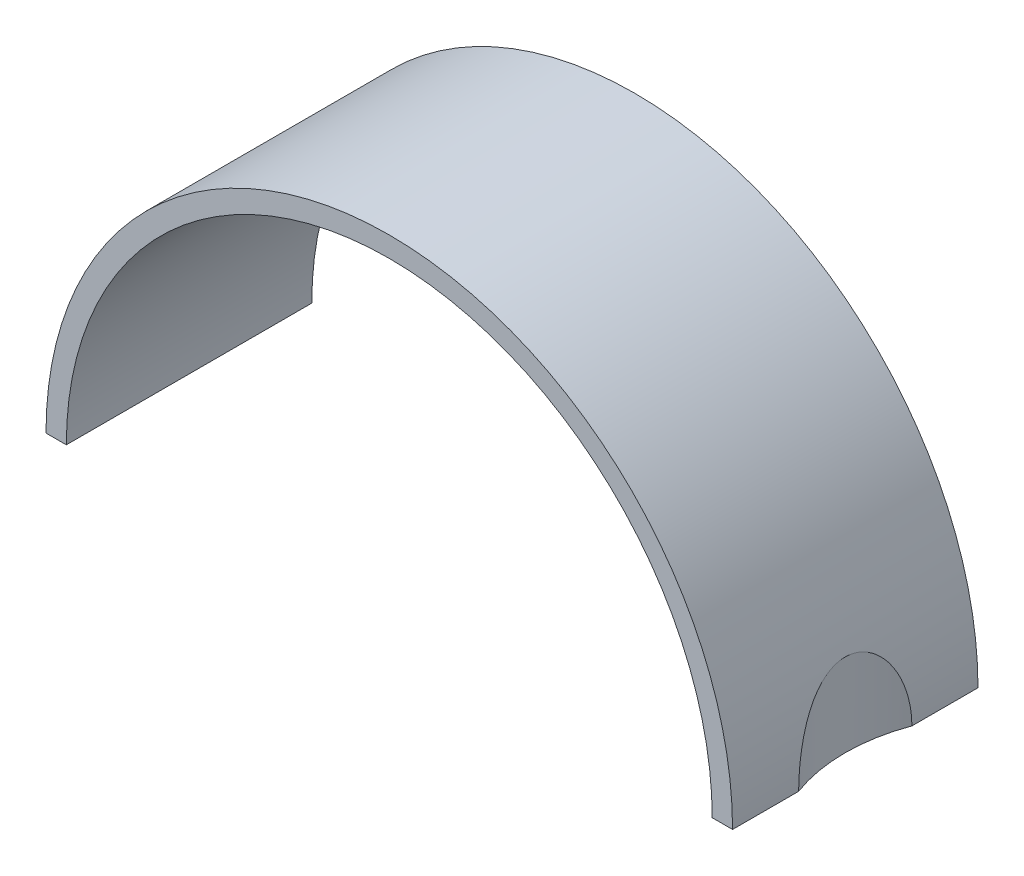
ISO-10303-21;
HEADER;
FILE_DESCRIPTION(('STEP AP214'),'2;1');
FILE_NAME('part.step','',(''),(''),'','','');
FILE_SCHEMA(('AUTOMOTIVE_DESIGN { 1 0 10303 214 1 1 1 1 }'));
ENDSEC;
DATA;
#1=APPLICATION_CONTEXT('core data for automotive mechanical design processes');
#2=APPLICATION_PROTOCOL_DEFINITION('international standard','automotive_design',2000,#1);
#3=PRODUCT_CONTEXT('',#1,'mechanical');
#4=PRODUCT('Part','Part','',(#3));
#5=PRODUCT_RELATED_PRODUCT_CATEGORY('part','',(#4));
#6=PRODUCT_DEFINITION_FORMATION('','',#4);
#7=PRODUCT_DEFINITION_CONTEXT('part definition',#1,'design');
#8=PRODUCT_DEFINITION('design','',#6,#7);
#9=PRODUCT_DEFINITION_SHAPE('','',#8);
#10=(LENGTH_UNIT() NAMED_UNIT(*) SI_UNIT(.MILLI.,.METRE.));
#11=(NAMED_UNIT(*) PLANE_ANGLE_UNIT() SI_UNIT($,.RADIAN.));
#12=(NAMED_UNIT(*) SI_UNIT($,.STERADIAN.) SOLID_ANGLE_UNIT());
#13=UNCERTAINTY_MEASURE_WITH_UNIT(LENGTH_MEASURE(1.E-05),#10,'distance_accuracy_value','');
#14=(GEOMETRIC_REPRESENTATION_CONTEXT(3) GLOBAL_UNCERTAINTY_ASSIGNED_CONTEXT((#13)) GLOBAL_UNIT_ASSIGNED_CONTEXT((#10,
#11,#12)) REPRESENTATION_CONTEXT('',''));
#15=CARTESIAN_POINT('',(0.,0.,0.));
#16=DIRECTION('',(0.,0.,1.));
#17=DIRECTION('',(1.,0.,0.));
#18=AXIS2_PLACEMENT_3D('',#15,#16,#17);
#19=CARTESIAN_POINT('',(0.,0.,12.065));
#20=DIRECTION('',(0.,0.,-1.));
#21=DIRECTION('',(-1.,0.,0.));
#22=AXIS2_PLACEMENT_3D('',#19,#20,#21);
#23=CYLINDRICAL_SURFACE('',#22,33.75);
#24=CARTESIAN_POINT('',(-33.75,0.,5.56776436283003));
#25=CARTESIAN_POINT('',(-33.7500109837308,0.230333311039514,5.56773961052475));
#26=CARTESIAN_POINT('',(-33.7476424256918,0.460676830070976,5.56141067102844));
#27=CARTESIAN_POINT('',(-33.7382228065685,0.920624637689262,5.5359635368808));
#28=CARTESIAN_POINT('',(-33.7311704045664,1.15022869565852,5.51684167978785));
#29=CARTESIAN_POINT('',(-33.7124012974862,1.60923478943243,5.46546761667873));
#30=CARTESIAN_POINT('',(-33.7006557197232,1.83862659619045,5.43313410342247));
#31=CARTESIAN_POINT('',(-33.6726672965941,2.29481576367553,5.35497666406551));
#32=CARTESIAN_POINT('',(-33.6564247813065,2.52161331355106,5.30915372808232));
#33=CARTESIAN_POINT('',(-33.6196501586511,2.97199577512927,5.20342701966692));
#34=CARTESIAN_POINT('',(-33.5991104530489,3.1955742362363,5.1434982817528));
#35=CARTESIAN_POINT('',(-33.5541035170069,3.63786219743599,5.00896829801096));
#36=CARTESIAN_POINT('',(-33.5296367120158,3.85657222203932,4.93436864138417));
#37=CARTESIAN_POINT('',(-33.4772777009829,4.28734704857669,4.76984340096331));
#38=CARTESIAN_POINT('',(-33.4493913086755,4.49942238035474,4.67994373089322));
#39=CARTESIAN_POINT('',(-33.3907942689233,4.9154377844209,4.4838862327981));
#40=CARTESIAN_POINT('',(-33.3600844642423,5.11938025840388,4.37773324999032));
#41=CARTESIAN_POINT('',(-33.2813645486656,5.6126469215715,4.09299492474728));
#42=CARTESIAN_POINT('',(-33.2321256995308,5.89596716861242,3.90409938175805));
#43=CARTESIAN_POINT('',(-33.1327974940333,6.43070998959373,3.48555504476004));
#44=CARTESIAN_POINT('',(-33.0827091486363,6.68216782393618,3.25595198700305));
#45=CARTESIAN_POINT('',(-32.9970011321686,7.09187401511154,2.80773987674006));
#46=CARTESIAN_POINT('',(-32.9605618822195,7.2585879382421,2.5970760144648));
#47=CARTESIAN_POINT('',(-32.8936257573369,7.55613346716949,2.15082464030115));
#48=CARTESIAN_POINT('',(-32.8631215836213,7.68700922746001,1.91526829793842));
#49=CARTESIAN_POINT('',(-32.815565183944,7.88734076389663,1.46193892828822));
#50=CARTESIAN_POINT('',(-32.7971547111388,7.96320402192492,1.24715402178861));
#51=CARTESIAN_POINT('',(-32.7688752994386,8.07879425070263,0.807489707695458));
#52=CARTESIAN_POINT('',(-32.7590016196063,8.11854127934987,0.582615976054002));
#53=CARTESIAN_POINT('',(-32.7489007809091,8.15919576526734,0.128503844518749));
#54=CARTESIAN_POINT('',(-32.7486999037908,8.15999740498264,-0.100744753901266));
#55=CARTESIAN_POINT('',(-32.7580358123926,8.12243410270886,-0.555791973162843));
#56=CARTESIAN_POINT('',(-32.7675738677974,8.08406405382642,-0.781590140268802));
#57=CARTESIAN_POINT('',(-32.794736718747,7.97312883126842,-1.21442161359433));
#58=CARTESIAN_POINT('',(-32.8120272871006,7.90197389166111,-1.42184382173922));
#59=CARTESIAN_POINT('',(-32.8529427371393,7.73009928180698,-1.82328583838594));
#60=CARTESIAN_POINT('',(-32.8765701414577,7.62936783592147,-2.01730027061266));
#61=CARTESIAN_POINT('',(-32.938510419791,7.35819944591783,-2.4628090315147));
#62=CARTESIAN_POINT('',(-32.978940628839,7.1759379376536,-2.70681020846286));
#63=CARTESIAN_POINT('',(-33.0637469365338,6.77445341613013,-3.16153671226112));
#64=CARTESIAN_POINT('',(-33.1081305990493,6.55515879973681,-3.37219601447322));
#65=CARTESIAN_POINT('',(-33.1834471704132,6.16025490740803,-3.70156596110986));
#66=CARTESIAN_POINT('',(-33.214375136515,5.99158000604004,-3.82878146975111));
#67=CARTESIAN_POINT('',(-33.2752836122117,5.64350828112261,-4.06797327477078));
#68=CARTESIAN_POINT('',(-33.3052637555901,5.46410738886757,-4.17994373476055));
#69=CARTESIAN_POINT('',(-33.3634991478446,5.09648222842652,-4.38946809543267));
#70=CARTESIAN_POINT('',(-33.3917516131212,4.9082445424027,-4.4869990729923));
#71=CARTESIAN_POINT('',(-33.4458605472416,4.52486738939379,-4.66821648782622));
#72=CARTESIAN_POINT('',(-33.4717163790286,4.32972610627813,-4.75189924867676));
#73=CARTESIAN_POINT('',(-33.5298516474961,3.85841294885057,-4.93554800434726));
#74=CARTESIAN_POINT('',(-33.5608163458429,3.57974056992124,-5.02953871137761));
#75=CARTESIAN_POINT('',(-33.6162728627213,3.01485460724612,-5.19401649793055));
#76=CARTESIAN_POINT('',(-33.6407615369121,2.72863743412677,-5.2644921643924));
#77=CARTESIAN_POINT('',(-33.6825983628592,2.1514457483953,-5.38306118289123));
#78=CARTESIAN_POINT('',(-33.6999540674167,1.86047660875596,-5.43117821663379));
#79=CARTESIAN_POINT('',(-33.7271547466553,1.27560327406337,-5.50597021060814));
#80=CARTESIAN_POINT('',(-33.7370040607086,0.981700874413561,-5.53265755961384));
#81=CARTESIAN_POINT('',(-33.7453353552038,0.572704405674839,-5.55518366636333));
#82=CARTESIAN_POINT('',(-33.7470857309835,0.458102546483722,-5.55990772886796));
#83=CARTESIAN_POINT('',(-33.7494170281217,0.229003963914845,-5.56619461383522));
#84=CARTESIAN_POINT('',(-33.7500000213513,0.114507415404837,-5.56776303695215));
#85=CARTESIAN_POINT('',(-33.75,0.,-5.56776436283003));
#86=B_SPLINE_CURVE_WITH_KNOTS('',3,(#24,#25,#26,#27,#28,#29,#30,#31,#32,#33,#34,#35,#36,#37,#38,
#39,#40,#41,#42,#43,#44,#45,#46,#47,#48,#49,#50,#51,#52,#53,#54,#55,#56,#57,#58,#59,#60,#61,#62,
#63,#64,#65,#66,#67,#68,#69,#70,#71,#72,#73,#74,#75,#76,#77,#78,#79,#80,#81,#82,#83,#84,#85),
.UNSPECIFIED.,.F.,.F.,(4,2,2,2,2,2,2,2,2,2,2,2,2,2,2,2,2,2,2,2,2,2,2,2,2,2,2,2,2,2,4),(0.,
0.690917334881247,1.38203255486709,2.07746668243187,2.77284977816923,3.46947299307642,
4.16602078904746,4.86140036948327,5.55657305494403,6.58542119563853,7.61312063300424,
8.42346449165496,9.23280542566376,9.91545695205609,10.5977291216153,11.2818549726601,
11.9660700259862,12.6232648381396,13.2807216625392,14.1973694358832,15.1158102671309,
15.7555746211608,16.395583216908,17.0365971951026,17.677781077587,18.5636839351268,
19.4500161436322,20.3354074192223,21.2202864695733,21.5643858893327,21.907874058024),.UNSPECIFIED.);
#87=CARTESIAN_POINT('',(-33.75,0.,5.56776436283003));
#88=VERTEX_POINT('',#87);
#89=CARTESIAN_POINT('',(-33.75,0.,-5.56776436283002));
#90=VERTEX_POINT('',#89);
#91=EDGE_CURVE('E60',#88,#90,#86,.T.);
#92=ORIENTED_EDGE('',*,*,#91,.F.);
#93=DIRECTION('',(0.,0.,-1.));
#94=VECTOR('',#93,1.);
#95=CARTESIAN_POINT('',(-33.75,0.,12.065));
#96=LINE('',#95,#94);
#97=CARTESIAN_POINT('',(-33.75,0.,12.065));
#98=VERTEX_POINT('',#97);
#99=EDGE_CURVE('E11',#98,#88,#96,.T.);
#100=ORIENTED_EDGE('',*,*,#99,.F.);
#101=CARTESIAN_POINT('',(0.,0.,12.065));
#102=DIRECTION('',(0.,0.,1.));
#103=DIRECTION('',(1.,0.,0.));
#104=AXIS2_PLACEMENT_3D('',#101,#102,#103);
#105=CIRCLE('',#104,33.75);
#106=CARTESIAN_POINT('',(33.75,0.,12.065));
#107=VERTEX_POINT('',#106);
#108=EDGE_CURVE('E119',#107,#98,#105,.T.);
#109=ORIENTED_EDGE('',*,*,#108,.F.);
#110=DIRECTION('',(0.,0.,-1.));
#111=VECTOR('',#110,1.);
#112=CARTESIAN_POINT('',(33.75,0.,12.065));
#113=LINE('',#112,#111);
#114=CARTESIAN_POINT('',(33.75,0.,5.56776436283003));
#115=VERTEX_POINT('',#114);
#116=EDGE_CURVE('E154',#107,#115,#113,.T.);
#117=ORIENTED_EDGE('',*,*,#116,.T.);
#118=CARTESIAN_POINT('',(33.75,0.,5.56776436283003));
#119=CARTESIAN_POINT('',(33.7500109837308,0.230333311039517,5.56773961052475));
#120=CARTESIAN_POINT('',(33.7476424256918,0.46067683007098,5.56141067102844));
#121=CARTESIAN_POINT('',(33.7382228065685,0.920624637689266,5.5359635368808));
#122=CARTESIAN_POINT('',(33.7311704045664,1.15022869565853,5.51684167978785));
#123=CARTESIAN_POINT('',(33.7124012974862,1.60923478943243,5.46546761667873));
#124=CARTESIAN_POINT('',(33.7006557197232,1.83862659619045,5.43313410342247));
#125=CARTESIAN_POINT('',(33.6726672965941,2.29481576367553,5.35497666406551));
#126=CARTESIAN_POINT('',(33.6564247813065,2.52161331355106,5.30915372808232));
#127=CARTESIAN_POINT('',(33.6196501586511,2.97199577512927,5.20342701966692));
#128=CARTESIAN_POINT('',(33.5991104530489,3.1955742362363,5.1434982817528));
#129=CARTESIAN_POINT('',(33.5541035170069,3.63786219743598,5.00896829801096));
#130=CARTESIAN_POINT('',(33.5296367120158,3.85657222203932,4.93436864138417));
#131=CARTESIAN_POINT('',(33.4772777009829,4.28734704857669,4.76984340096331));
#132=CARTESIAN_POINT('',(33.4493913086755,4.49942238035473,4.67994373089323));
#133=CARTESIAN_POINT('',(33.3907942689233,4.91543778442089,4.4838862327981));
#134=CARTESIAN_POINT('',(33.3600844642423,5.11938025840388,4.37773324999032));
#135=CARTESIAN_POINT('',(33.2813645486656,5.6126469215715,4.09299492474728));
#136=CARTESIAN_POINT('',(33.2321256995308,5.89596716861242,3.90409938175805));
#137=CARTESIAN_POINT('',(33.1327974940333,6.43070998959374,3.48555504476004));
#138=CARTESIAN_POINT('',(33.0827091486363,6.68216782393619,3.25595198700305));
#139=CARTESIAN_POINT('',(32.9970011321686,7.09187401511154,2.80773987674006));
#140=CARTESIAN_POINT('',(32.9605618822195,7.2585879382421,2.59707601446479));
#141=CARTESIAN_POINT('',(32.8936257573369,7.55613346716948,2.15082464030113));
#142=CARTESIAN_POINT('',(32.8631215836213,7.68700922745999,1.9152682979384));
#143=CARTESIAN_POINT('',(32.815565183944,7.88734076389662,1.4619389282882));
#144=CARTESIAN_POINT('',(32.7971547111388,7.96320402192493,1.2471540217886));
#145=CARTESIAN_POINT('',(32.7688752994386,8.07879425070265,0.807489707695458));
#146=CARTESIAN_POINT('',(32.7590016196063,8.11854127934989,0.582615976054002));
#147=CARTESIAN_POINT('',(32.7489007809091,8.15919576526735,0.128503844518752));
#148=CARTESIAN_POINT('',(32.7486999037908,8.15999740498263,-0.100744753901262));
#149=CARTESIAN_POINT('',(32.7580358123926,8.12243410270885,-0.555791973162835));
#150=CARTESIAN_POINT('',(32.7675738677974,8.08406405382643,-0.781590140268795));
#151=CARTESIAN_POINT('',(32.794736718747,7.97312883126843,-1.21442161359432));
#152=CARTESIAN_POINT('',(32.8120272871006,7.90197389166111,-1.4218438217392));
#153=CARTESIAN_POINT('',(32.8529427371393,7.73009928180697,-1.82328583838592));
#154=CARTESIAN_POINT('',(32.8765701414577,7.62936783592146,-2.01730027061265));
#155=CARTESIAN_POINT('',(32.938510419791,7.35819944591781,-2.46280903151468));
#156=CARTESIAN_POINT('',(32.978940628839,7.17593793765359,-2.70681020846284));
#157=CARTESIAN_POINT('',(33.0637469365338,6.77445341613013,-3.1615367122611));
#158=CARTESIAN_POINT('',(33.1081305990493,6.55515879973683,-3.37219601447321));
#159=CARTESIAN_POINT('',(33.1834471704132,6.16025490740807,-3.70156596110986));
#160=CARTESIAN_POINT('',(33.214375136515,5.99158000604007,-3.82878146975111));
#161=CARTESIAN_POINT('',(33.2752836122117,5.64350828112263,-4.06797327477077));
#162=CARTESIAN_POINT('',(33.3052637555901,5.46410738886759,-4.17994373476052));
#163=CARTESIAN_POINT('',(33.3634991478446,5.09648222842653,-4.38946809543264));
#164=CARTESIAN_POINT('',(33.3917516131212,4.90824454240272,-4.48699907299229));
#165=CARTESIAN_POINT('',(33.4458605472416,4.52486738939382,-4.66821648782621));
#166=CARTESIAN_POINT('',(33.4717163790286,4.32972610627816,-4.75189924867675));
#167=CARTESIAN_POINT('',(33.5298516474961,3.8584129488506,-4.93554800434725));
#168=CARTESIAN_POINT('',(33.5608163458429,3.57974056992126,-5.02953871137759));
#169=CARTESIAN_POINT('',(33.6162728627213,3.01485460724614,-5.19401649793053));
#170=CARTESIAN_POINT('',(33.6407615369121,2.7286374341268,-5.26449216439238));
#171=CARTESIAN_POINT('',(33.6825983628592,2.15144574839533,-5.38306118289121));
#172=CARTESIAN_POINT('',(33.6999540674167,1.86047660875599,-5.43117821663379));
#173=CARTESIAN_POINT('',(33.7271547466553,1.27560327406341,-5.50597021060814));
#174=CARTESIAN_POINT('',(33.7370040607086,0.981700874413593,-5.53265755961384));
#175=CARTESIAN_POINT('',(33.7453353552038,0.572704405674869,-5.55518366636333));
#176=CARTESIAN_POINT('',(33.7470857309835,0.458102546483747,-5.55990772886797));
#177=CARTESIAN_POINT('',(33.7494170281217,0.22900396391486,-5.56619461383522));
#178=CARTESIAN_POINT('',(33.7500000213513,0.114507415404847,-5.56776303695216));
#179=CARTESIAN_POINT('',(33.75,0.,-5.56776436283003));
#180=B_SPLINE_CURVE_WITH_KNOTS('',3,(#118,#119,#120,#121,#122,#123,#124,#125,#126,#127,#128,
#129,#130,#131,#132,#133,#134,#135,#136,#137,#138,#139,#140,#141,#142,#143,#144,#145,#146,#147,
#148,#149,#150,#151,#152,#153,#154,#155,#156,#157,#158,#159,#160,#161,#162,#163,#164,#165,#166,
#167,#168,#169,#170,#171,#172,#173,#174,#175,#176,#177,#178,#179),.UNSPECIFIED.,.F.,.F.,(4,2,2,
2,2,2,2,2,2,2,2,2,2,2,2,2,2,2,2,2,2,2,2,2,2,2,2,2,2,2,4),(0.,0.690917334881246,1.38203255486709,
2.07746668243186,2.77284977816922,3.46947299307641,4.16602078904745,4.86140036948326,
5.55657305494402,6.58542119563853,7.61312063300424,8.42346449165496,9.23280542566376,
9.91545695205609,10.5977291216153,11.2818549726601,11.9660700259861,12.6232648381395,
13.2807216625392,14.1973694358832,15.1158102671309,15.7555746211608,16.3955832169079,
17.0365971951026,17.677781077587,18.5636839351267,19.4500161436322,20.3354074192222,
21.2202864695732,21.5643858893326,21.907874058024),.UNSPECIFIED.);
#181=CARTESIAN_POINT('',(33.75,0.,-5.56776436283003));
#182=VERTEX_POINT('',#181);
#183=EDGE_CURVE('E67',#115,#182,#180,.T.);
#184=ORIENTED_EDGE('',*,*,#183,.T.);
#185=CARTESIAN_POINT('',(33.75,0.,-12.065));
#186=VERTEX_POINT('',#185);
#187=EDGE_CURVE('E145',#182,#186,#113,.T.);
#188=ORIENTED_EDGE('',*,*,#187,.T.);
#189=CARTESIAN_POINT('',(0.,0.,-12.065));
#190=DIRECTION('',(0.,0.,1.));
#191=DIRECTION('',(1.,0.,0.));
#192=AXIS2_PLACEMENT_3D('',#189,#190,#191);
#193=CIRCLE('',#192,33.75);
#194=CARTESIAN_POINT('',(-33.75,0.,-12.065));
#195=VERTEX_POINT('',#194);
#196=EDGE_CURVE('E146',#186,#195,#193,.T.);
#197=ORIENTED_EDGE('',*,*,#196,.T.);
#198=EDGE_CURVE('E54',#90,#195,#96,.T.);
#199=ORIENTED_EDGE('',*,*,#198,.F.);
#200=EDGE_LOOP('',(#92,#100,#109,#117,#184,#188,#197,#199));
#201=FACE_BOUND('',#200,.T.);
#202=ADVANCED_FACE('F45',(#201),#23,.T.);
#203=CARTESIAN_POINT('',(-31.75,0.,12.065));
#204=DIRECTION('',(0.,1.,0.));
#205=DIRECTION('',(0.,0.,1.));
#206=AXIS2_PLACEMENT_3D('',#203,#204,#205);
#207=PLANE('',#206);
#208=CARTESIAN_POINT('',(-48.75,0.,0.));
#209=DIRECTION('',(0.,1.,0.));
#210=DIRECTION('',(0.,0.,-1.));
#211=AXIS2_PLACEMENT_3D('',#208,#209,#210);
#212=CIRCLE('',#211,16.);
#213=EDGE_CURVE('E96',#88,#90,#212,.T.);
#214=ORIENTED_EDGE('',*,*,#213,.T.);
#215=ORIENTED_EDGE('',*,*,#198,.T.);
#216=DIRECTION('',(1.,0.,0.));
#217=VECTOR('',#216,1.);
#218=CARTESIAN_POINT('',(-31.75,0.,-12.065));
#219=LINE('',#218,#217);
#220=CARTESIAN_POINT('',(-31.75,0.,-12.065));
#221=VERTEX_POINT('',#220);
#222=EDGE_CURVE('E149',#195,#221,#219,.T.);
#223=ORIENTED_EDGE('',*,*,#222,.T.);
#224=DIRECTION('',(0.,0.,-1.));
#225=VECTOR('',#224,1.);
#226=CARTESIAN_POINT('',(-31.75,0.,12.065));
#227=LINE('',#226,#225);
#228=CARTESIAN_POINT('',(-31.75,0.,12.065));
#229=VERTEX_POINT('',#228);
#230=EDGE_CURVE('E114',#229,#221,#227,.T.);
#231=ORIENTED_EDGE('',*,*,#230,.F.);
#232=DIRECTION('',(1.,0.,0.));
#233=VECTOR('',#232,1.);
#234=CARTESIAN_POINT('',(-31.75,0.,12.065));
#235=LINE('',#234,#233);
#236=EDGE_CURVE('E111',#98,#229,#235,.T.);
#237=ORIENTED_EDGE('',*,*,#236,.F.);
#238=ORIENTED_EDGE('',*,*,#99,.T.);
#239=EDGE_LOOP('',(#214,#215,#223,#231,#237,#238));
#240=FACE_BOUND('',#239,.T.);
#241=ADVANCED_FACE('F109',(#240),#207,.F.);
#242=CARTESIAN_POINT('',(0.,0.,12.065));
#243=DIRECTION('',(0.,0.,-1.));
#244=DIRECTION('',(-1.,0.,0.));
#245=AXIS2_PLACEMENT_3D('',#242,#243,#244);
#246=CYLINDRICAL_SURFACE('',#245,31.75);
#247=CARTESIAN_POINT('',(0.,0.,-12.065));
#248=DIRECTION('',(0.,0.,-1.));
#249=DIRECTION('',(1.,0.,0.));
#250=AXIS2_PLACEMENT_3D('',#247,#248,#249);
#251=CIRCLE('',#250,31.75);
#252=CARTESIAN_POINT('',(31.75,0.,-12.065));
#253=VERTEX_POINT('',#252);
#254=EDGE_CURVE('E131',#221,#253,#251,.T.);
#255=ORIENTED_EDGE('',*,*,#254,.T.);
#256=DIRECTION('',(0.,0.,-1.));
#257=VECTOR('',#256,1.);
#258=CARTESIAN_POINT('',(31.75,0.,12.065));
#259=LINE('',#258,#257);
#260=CARTESIAN_POINT('',(31.75,0.,12.065));
#261=VERTEX_POINT('',#260);
#262=EDGE_CURVE('E157',#261,#253,#259,.T.);
#263=ORIENTED_EDGE('',*,*,#262,.F.);
#264=CARTESIAN_POINT('',(0.,0.,12.065));
#265=DIRECTION('',(0.,0.,-1.));
#266=DIRECTION('',(1.,0.,0.));
#267=AXIS2_PLACEMENT_3D('',#264,#265,#266);
#268=CIRCLE('',#267,31.75);
#269=EDGE_CURVE('E118',#229,#261,#268,.T.);
#270=ORIENTED_EDGE('',*,*,#269,.F.);
#271=ORIENTED_EDGE('',*,*,#230,.T.);
#272=EDGE_LOOP('',(#255,#263,#270,#271));
#273=FACE_BOUND('',#272,.T.);
#274=ADVANCED_FACE('F174',(#273),#246,.F.);
#275=CARTESIAN_POINT('',(33.75,0.,12.065));
#276=DIRECTION('',(0.,1.,0.));
#277=DIRECTION('',(0.,0.,1.));
#278=AXIS2_PLACEMENT_3D('',#275,#276,#277);
#279=PLANE('',#278);
#280=ORIENTED_EDGE('',*,*,#187,.F.);
#281=CARTESIAN_POINT('',(48.75,0.,0.));
#282=DIRECTION('',(0.,-1.,0.));
#283=DIRECTION('',(0.,0.,-1.));
#284=AXIS2_PLACEMENT_3D('',#281,#282,#283);
#285=CIRCLE('',#284,16.);
#286=EDGE_CURVE('E107',#115,#182,#285,.T.);
#287=ORIENTED_EDGE('',*,*,#286,.F.);
#288=ORIENTED_EDGE('',*,*,#116,.F.);
#289=DIRECTION('',(1.,0.,0.));
#290=VECTOR('',#289,1.);
#291=CARTESIAN_POINT('',(33.75,0.,12.065));
#292=LINE('',#291,#290);
#293=EDGE_CURVE('E123',#261,#107,#292,.T.);
#294=ORIENTED_EDGE('',*,*,#293,.F.);
#295=ORIENTED_EDGE('',*,*,#262,.T.);
#296=DIRECTION('',(1.,0.,0.));
#297=VECTOR('',#296,1.);
#298=CARTESIAN_POINT('',(33.75,0.,-12.065));
#299=LINE('',#298,#297);
#300=EDGE_CURVE('E127',#253,#186,#299,.T.);
#301=ORIENTED_EDGE('',*,*,#300,.T.);
#302=EDGE_LOOP('',(#280,#287,#288,#294,#295,#301));
#303=FACE_BOUND('',#302,.T.);
#304=ADVANCED_FACE('F172',(#303),#279,.F.);
#305=CARTESIAN_POINT('',(0.,0.,12.065));
#306=DIRECTION('',(0.,0.,1.));
#307=DIRECTION('',(1.,0.,0.));
#308=AXIS2_PLACEMENT_3D('',#305,#306,#307);
#309=PLANE('',#308);
#310=ORIENTED_EDGE('',*,*,#108,.T.);
#311=ORIENTED_EDGE('',*,*,#236,.T.);
#312=ORIENTED_EDGE('',*,*,#269,.T.);
#313=ORIENTED_EDGE('',*,*,#293,.T.);
#314=EDGE_LOOP('',(#310,#311,#312,#313));
#315=FACE_BOUND('',#314,.T.);
#316=ADVANCED_FACE('F121',(#315),#309,.T.);
#317=CARTESIAN_POINT('',(0.,0.,-12.065));
#318=DIRECTION('',(0.,0.,1.));
#319=DIRECTION('',(1.,0.,0.));
#320=AXIS2_PLACEMENT_3D('',#317,#318,#319);
#321=PLANE('',#320);
#322=ORIENTED_EDGE('',*,*,#196,.F.);
#323=ORIENTED_EDGE('',*,*,#300,.F.);
#324=ORIENTED_EDGE('',*,*,#254,.F.);
#325=ORIENTED_EDGE('',*,*,#222,.F.);
#326=EDGE_LOOP('',(#322,#323,#324,#325));
#327=FACE_BOUND('',#326,.T.);
#328=ADVANCED_FACE('F167',(#327),#321,.F.);
#329=CARTESIAN_POINT('',(48.75,33.75,0.));
#330=DIRECTION('',(0.,-1.,0.));
#331=DIRECTION('',(0.,0.,-1.));
#332=AXIS2_PLACEMENT_3D('',#329,#330,#331);
#333=CYLINDRICAL_SURFACE('',#332,16.);
#334=ORIENTED_EDGE('',*,*,#286,.T.);
#335=ORIENTED_EDGE('',*,*,#183,.F.);
#336=EDGE_LOOP('',(#334,#335));
#337=FACE_BOUND('',#336,.T.);
#338=ADVANCED_FACE('F191',(#337),#333,.F.);
#339=CARTESIAN_POINT('',(-48.75,33.75,0.));
#340=DIRECTION('',(0.,-1.,0.));
#341=DIRECTION('',(0.,0.,-1.));
#342=AXIS2_PLACEMENT_3D('',#339,#340,#341);
#343=CYLINDRICAL_SURFACE('',#342,16.);
#344=ORIENTED_EDGE('',*,*,#91,.T.);
#345=ORIENTED_EDGE('',*,*,#213,.F.);
#346=EDGE_LOOP('',(#344,#345));
#347=FACE_BOUND('',#346,.T.);
#348=ADVANCED_FACE('F97',(#347),#343,.F.);
#349=CLOSED_SHELL('',(#202,#241,#274,#304,#316,#328,#338,#348));
#350=MANIFOLD_SOLID_BREP('B2',#349);
#351=ADVANCED_BREP_SHAPE_REPRESENTATION('',(#18,#350),#14);
#352=SHAPE_DEFINITION_REPRESENTATION(#9,#351);
ENDSEC;
END-ISO-10303-21;
